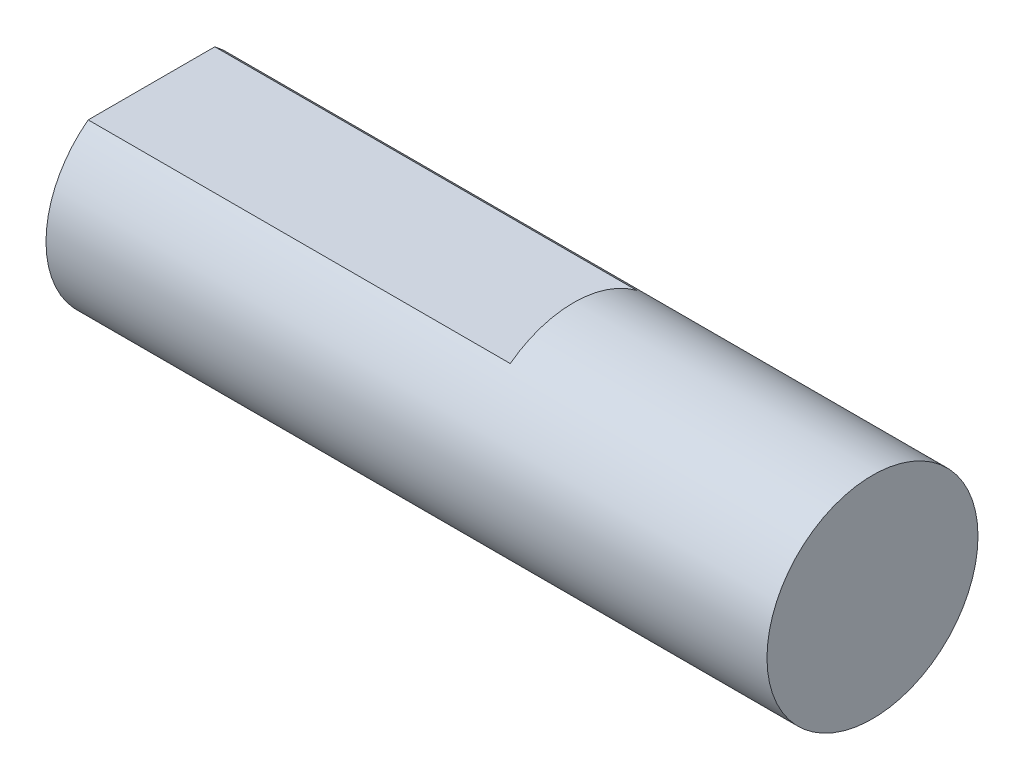
ISO-10303-21;
HEADER;
FILE_DESCRIPTION(('STEP AP214'),'2;1');
FILE_NAME('part.step','',(''),(''),'','','');
FILE_SCHEMA(('AUTOMOTIVE_DESIGN { 1 0 10303 214 1 1 1 1 }'));
ENDSEC;
DATA;
#1=APPLICATION_CONTEXT('core data for automotive mechanical design processes');
#2=APPLICATION_PROTOCOL_DEFINITION('international standard','automotive_design',2000,#1);
#3=PRODUCT_CONTEXT('',#1,'mechanical');
#4=PRODUCT('Part','Part','',(#3));
#5=PRODUCT_RELATED_PRODUCT_CATEGORY('part','',(#4));
#6=PRODUCT_DEFINITION_FORMATION('','',#4);
#7=PRODUCT_DEFINITION_CONTEXT('part definition',#1,'design');
#8=PRODUCT_DEFINITION('design','',#6,#7);
#9=PRODUCT_DEFINITION_SHAPE('','',#8);
#10=(LENGTH_UNIT() NAMED_UNIT(*) SI_UNIT(.MILLI.,.METRE.));
#11=(NAMED_UNIT(*) PLANE_ANGLE_UNIT() SI_UNIT($,.RADIAN.));
#12=(NAMED_UNIT(*) SI_UNIT($,.STERADIAN.) SOLID_ANGLE_UNIT());
#13=UNCERTAINTY_MEASURE_WITH_UNIT(LENGTH_MEASURE(1.E-05),#10,'distance_accuracy_value','');
#14=(GEOMETRIC_REPRESENTATION_CONTEXT(3) GLOBAL_UNCERTAINTY_ASSIGNED_CONTEXT((#13)) GLOBAL_UNIT_ASSIGNED_CONTEXT((#10,
#11,#12)) REPRESENTATION_CONTEXT('',''));
#15=CARTESIAN_POINT('',(0.,0.,0.));
#16=DIRECTION('',(0.,0.,1.));
#17=DIRECTION('',(1.,0.,0.));
#18=AXIS2_PLACEMENT_3D('',#15,#16,#17);
#19=CARTESIAN_POINT('',(-20.5,0.,0.));
#20=DIRECTION('',(-1.,0.,0.));
#21=DIRECTION('',(0.,0.,1.));
#22=AXIS2_PLACEMENT_3D('',#19,#20,#21);
#23=CYLINDRICAL_SURFACE('',#22,3.);
#24=CARTESIAN_POINT('',(0.,0.,0.));
#25=DIRECTION('',(-1.,0.,0.));
#26=DIRECTION('',(0.,0.,1.));
#27=AXIS2_PLACEMENT_3D('',#24,#25,#26);
#28=CIRCLE('',#27,3.);
#29=CARTESIAN_POINT('',(0.,0.,3.));
#30=VERTEX_POINT('',#29);
#31=EDGE_CURVE('E13',#30,#30,#28,.T.);
#32=ORIENTED_EDGE('',*,*,#31,.T.);
#33=EDGE_LOOP('',(#32));
#34=FACE_BOUND('',#33,.T.);
#35=DIRECTION('',(-1.,0.,0.));
#36=VECTOR('',#35,1.);
#37=CARTESIAN_POINT('',(-20.5,2.4,-1.8));
#38=LINE('',#37,#36);
#39=CARTESIAN_POINT('',(-8.5,2.4,-1.8));
#40=VERTEX_POINT('',#39);
#41=CARTESIAN_POINT('',(-20.5,2.4,-1.8));
#42=VERTEX_POINT('',#41);
#43=EDGE_CURVE('E59',#40,#42,#38,.T.);
#44=ORIENTED_EDGE('',*,*,#43,.F.);
#45=CARTESIAN_POINT('',(-8.5,0.,0.));
#46=DIRECTION('',(-1.,0.,0.));
#47=DIRECTION('',(0.,0.,1.));
#48=AXIS2_PLACEMENT_3D('',#45,#46,#47);
#49=CIRCLE('',#48,3.);
#50=CARTESIAN_POINT('',(-8.5,2.4,1.8));
#51=VERTEX_POINT('',#50);
#52=EDGE_CURVE('E72',#40,#51,#49,.F.);
#53=ORIENTED_EDGE('',*,*,#52,.T.);
#54=DIRECTION('',(-1.,0.,0.));
#55=VECTOR('',#54,1.);
#56=CARTESIAN_POINT('',(-20.5,2.4,1.8));
#57=LINE('',#56,#55);
#58=CARTESIAN_POINT('',(-20.5,2.4,1.8));
#59=VERTEX_POINT('',#58);
#60=EDGE_CURVE('E76',#51,#59,#57,.T.);
#61=ORIENTED_EDGE('',*,*,#60,.T.);
#62=CARTESIAN_POINT('',(-20.5,0.,0.));
#63=DIRECTION('',(-1.,0.,0.));
#64=DIRECTION('',(0.,0.,1.));
#65=AXIS2_PLACEMENT_3D('',#62,#63,#64);
#66=CIRCLE('',#65,3.);
#67=EDGE_CURVE('E52',#42,#59,#66,.T.);
#68=ORIENTED_EDGE('',*,*,#67,.F.);
#69=EDGE_LOOP('',(#44,#53,#61,#68));
#70=FACE_BOUND('',#69,.T.);
#71=ADVANCED_FACE('F44',(#34,#70),#23,.T.);
#72=CARTESIAN_POINT('',(-20.5,3.,0.));
#73=DIRECTION('',(1.,0.,0.));
#74=DIRECTION('',(0.,0.,-1.));
#75=AXIS2_PLACEMENT_3D('',#72,#73,#74);
#76=PLANE('',#75);
#77=DIRECTION('',(0.,0.,-1.));
#78=VECTOR('',#77,1.);
#79=CARTESIAN_POINT('',(-20.5,2.4,3.001));
#80=LINE('',#79,#78);
#81=EDGE_CURVE('E63',#59,#42,#80,.T.);
#82=ORIENTED_EDGE('',*,*,#81,.T.);
#83=ORIENTED_EDGE('',*,*,#67,.T.);
#84=EDGE_LOOP('',(#82,#83));
#85=FACE_BOUND('',#84,.T.);
#86=ADVANCED_FACE('F86',(#85),#76,.F.);
#87=CARTESIAN_POINT('',(0.,0.,0.));
#88=DIRECTION('',(-1.,0.,0.));
#89=DIRECTION('',(0.,0.,1.));
#90=AXIS2_PLACEMENT_3D('',#87,#88,#89);
#91=PLANE('',#90);
#92=ORIENTED_EDGE('',*,*,#31,.F.);
#93=EDGE_LOOP('',(#92));
#94=FACE_BOUND('',#93,.T.);
#95=ADVANCED_FACE('F46',(#94),#91,.F.);
#96=CARTESIAN_POINT('',(-20.5,2.4,3.001));
#97=DIRECTION('',(0.,1.,0.));
#98=DIRECTION('',(0.,0.,1.));
#99=AXIS2_PLACEMENT_3D('',#96,#97,#98);
#100=PLANE('',#99);
#101=DIRECTION('',(0.,0.,-1.));
#102=VECTOR('',#101,1.);
#103=CARTESIAN_POINT('',(-8.5,2.4,3.001));
#104=LINE('',#103,#102);
#105=EDGE_CURVE('E74',#51,#40,#104,.T.);
#106=ORIENTED_EDGE('',*,*,#105,.T.);
#107=ORIENTED_EDGE('',*,*,#43,.T.);
#108=ORIENTED_EDGE('',*,*,#81,.F.);
#109=ORIENTED_EDGE('',*,*,#60,.F.);
#110=EDGE_LOOP('',(#106,#107,#108,#109));
#111=FACE_BOUND('',#110,.T.);
#112=ADVANCED_FACE('F78',(#111),#100,.T.);
#113=CARTESIAN_POINT('',(-8.5,2.4,3.001));
#114=DIRECTION('',(-1.,0.,0.));
#115=DIRECTION('',(0.,0.,1.));
#116=AXIS2_PLACEMENT_3D('',#113,#114,#115);
#117=PLANE('',#116);
#118=ORIENTED_EDGE('',*,*,#105,.F.);
#119=ORIENTED_EDGE('',*,*,#52,.F.);
#120=EDGE_LOOP('',(#118,#119));
#121=FACE_BOUND('',#120,.T.);
#122=ADVANCED_FACE('F73',(#121),#117,.T.);
#123=CLOSED_SHELL('',(#71,#86,#95,#112,#122));
#124=MANIFOLD_SOLID_BREP('B2',#123);
#125=ADVANCED_BREP_SHAPE_REPRESENTATION('',(#18,#124),#14);
#126=SHAPE_DEFINITION_REPRESENTATION(#9,#125);
ENDSEC;
END-ISO-10303-21;
